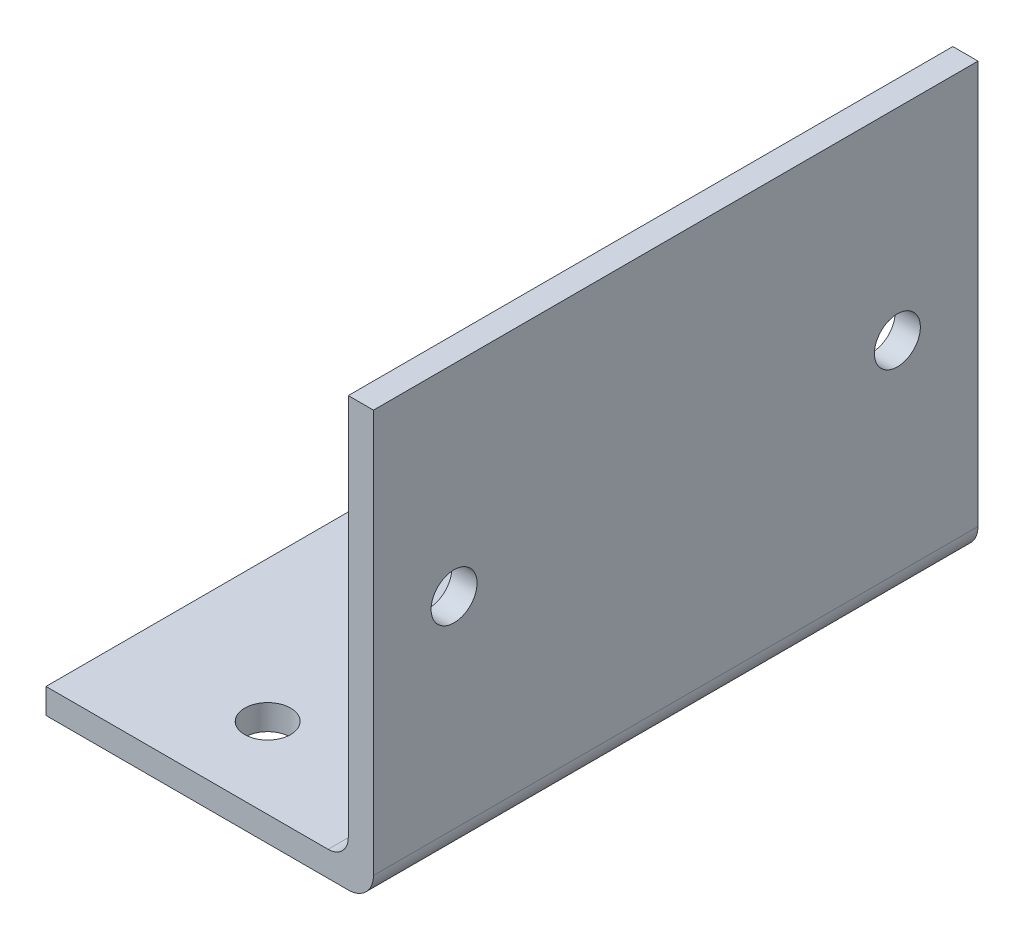
ISO-10303-21;
HEADER;
FILE_DESCRIPTION(('STEP AP214'),'2;1');
FILE_NAME('part.step','',(''),(''),'','','');
FILE_SCHEMA(('AUTOMOTIVE_DESIGN { 1 0 10303 214 1 1 1 1 }'));
ENDSEC;
DATA;
#1=APPLICATION_CONTEXT('core data for automotive mechanical design processes');
#2=APPLICATION_PROTOCOL_DEFINITION('international standard','automotive_design',2000,#1);
#3=PRODUCT_CONTEXT('',#1,'mechanical');
#4=PRODUCT('Part','Part','',(#3));
#5=PRODUCT_RELATED_PRODUCT_CATEGORY('part','',(#4));
#6=PRODUCT_DEFINITION_FORMATION('','',#4);
#7=PRODUCT_DEFINITION_CONTEXT('part definition',#1,'design');
#8=PRODUCT_DEFINITION('design','',#6,#7);
#9=PRODUCT_DEFINITION_SHAPE('','',#8);
#10=(LENGTH_UNIT() NAMED_UNIT(*) SI_UNIT(.MILLI.,.METRE.));
#11=(NAMED_UNIT(*) PLANE_ANGLE_UNIT() SI_UNIT($,.RADIAN.));
#12=(NAMED_UNIT(*) SI_UNIT($,.STERADIAN.) SOLID_ANGLE_UNIT());
#13=UNCERTAINTY_MEASURE_WITH_UNIT(LENGTH_MEASURE(1.E-05),#10,'distance_accuracy_value','');
#14=(GEOMETRIC_REPRESENTATION_CONTEXT(3) GLOBAL_UNCERTAINTY_ASSIGNED_CONTEXT((#13)) GLOBAL_UNIT_ASSIGNED_CONTEXT((#10,
#11,#12)) REPRESENTATION_CONTEXT('',''));
#15=CARTESIAN_POINT('',(0.,0.,0.));
#16=DIRECTION('',(0.,0.,1.));
#17=DIRECTION('',(1.,0.,0.));
#18=AXIS2_PLACEMENT_3D('',#15,#16,#17);
#19=CARTESIAN_POINT('',(0.,3.175,76.2));
#20=DIRECTION('',(1.,0.,0.));
#21=DIRECTION('',(0.,1.,0.));
#22=AXIS2_PLACEMENT_3D('',#19,#20,#21);
#23=PLANE('',#22);
#24=DIRECTION('',(0.,-1.,0.));
#25=VECTOR('',#24,1.);
#26=CARTESIAN_POINT('',(0.,3.175,0.));
#27=LINE('',#26,#25);
#28=CARTESIAN_POINT('',(0.,3.175,0.));
#29=VERTEX_POINT('',#28);
#30=CARTESIAN_POINT('',(0.,0.,0.));
#31=VERTEX_POINT('',#30);
#32=EDGE_CURVE('E141',#29,#31,#27,.T.);
#33=ORIENTED_EDGE('',*,*,#32,.T.);
#34=DIRECTION('',(0.,0.,-1.));
#35=VECTOR('',#34,1.);
#36=CARTESIAN_POINT('',(0.,0.,76.2));
#37=LINE('',#36,#35);
#38=CARTESIAN_POINT('',(0.,0.,76.2));
#39=VERTEX_POINT('',#38);
#40=EDGE_CURVE('E11',#39,#31,#37,.T.);
#41=ORIENTED_EDGE('',*,*,#40,.F.);
#42=DIRECTION('',(0.,-1.,0.));
#43=VECTOR('',#42,1.);
#44=CARTESIAN_POINT('',(0.,3.175,76.2));
#45=LINE('',#44,#43);
#46=CARTESIAN_POINT('',(0.,3.175,76.2));
#47=VERTEX_POINT('',#46);
#48=EDGE_CURVE('E164',#47,#39,#45,.T.);
#49=ORIENTED_EDGE('',*,*,#48,.F.);
#50=DIRECTION('',(0.,0.,-1.));
#51=VECTOR('',#50,1.);
#52=CARTESIAN_POINT('',(0.,3.175,76.2));
#53=LINE('',#52,#51);
#54=EDGE_CURVE('E137',#47,#29,#53,.T.);
#55=ORIENTED_EDGE('',*,*,#54,.T.);
#56=EDGE_LOOP('',(#33,#41,#49,#55));
#57=FACE_BOUND('',#56,.T.);
#58=ADVANCED_FACE('F39',(#57),#23,.F.);
#59=CARTESIAN_POINT('',(0.,0.,76.2));
#60=DIRECTION('',(0.,1.,0.));
#61=DIRECTION('',(0.,0.,1.));
#62=AXIS2_PLACEMENT_3D('',#59,#60,#61);
#63=PLANE('',#62);
#64=CARTESIAN_POINT('',(17.78,0.,66.04));
#65=DIRECTION('',(0.,1.,0.));
#66=DIRECTION('',(0.,0.,1.));
#67=AXIS2_PLACEMENT_3D('',#64,#65,#66);
#68=CIRCLE('',#67,2.89559999999999);
#69=CARTESIAN_POINT('',(17.78,0.,68.9356));
#70=VERTEX_POINT('',#69);
#71=EDGE_CURVE('E216',#70,#70,#68,.T.);
#72=ORIENTED_EDGE('',*,*,#71,.T.);
#73=EDGE_LOOP('',(#72));
#74=FACE_BOUND('',#73,.T.);
#75=CARTESIAN_POINT('',(17.78,0.,10.16));
#76=DIRECTION('',(0.,1.,0.));
#77=DIRECTION('',(0.,0.,1.));
#78=AXIS2_PLACEMENT_3D('',#75,#76,#77);
#79=CIRCLE('',#78,2.89559999999999);
#80=CARTESIAN_POINT('',(17.78,0.,13.0556));
#81=VERTEX_POINT('',#80);
#82=EDGE_CURVE('E146',#81,#81,#79,.T.);
#83=ORIENTED_EDGE('',*,*,#82,.T.);
#84=EDGE_LOOP('',(#83));
#85=FACE_BOUND('',#84,.T.);
#86=DIRECTION('',(1.,0.,0.));
#87=VECTOR('',#86,1.);
#88=CARTESIAN_POINT('',(0.,0.,0.));
#89=LINE('',#88,#87);
#90=CARTESIAN_POINT('',(38.1,0.,0.));
#91=VERTEX_POINT('',#90);
#92=EDGE_CURVE('E145',#31,#91,#89,.T.);
#93=ORIENTED_EDGE('',*,*,#92,.T.);
#94=DIRECTION('',(0.,0.,-1.));
#95=VECTOR('',#94,1.);
#96=CARTESIAN_POINT('',(38.1,0.,76.2));
#97=LINE('',#96,#95);
#98=CARTESIAN_POINT('',(38.1,0.,76.2));
#99=VERTEX_POINT('',#98);
#100=EDGE_CURVE('E49',#99,#91,#97,.T.);
#101=ORIENTED_EDGE('',*,*,#100,.F.);
#102=DIRECTION('',(1.,0.,0.));
#103=VECTOR('',#102,1.);
#104=CARTESIAN_POINT('',(0.,0.,76.2));
#105=LINE('',#104,#103);
#106=EDGE_CURVE('E100',#39,#99,#105,.T.);
#107=ORIENTED_EDGE('',*,*,#106,.F.);
#108=ORIENTED_EDGE('',*,*,#40,.T.);
#109=EDGE_LOOP('',(#93,#101,#107,#108));
#110=FACE_BOUND('',#109,.T.);
#111=ADVANCED_FACE('F265',(#74,#85,#110),#63,.F.);
#112=CARTESIAN_POINT('',(38.1,3.175,76.2));
#113=DIRECTION('',(0.,0.,-1.));
#114=DIRECTION('',(-1.,0.,0.));
#115=AXIS2_PLACEMENT_3D('',#112,#113,#114);
#116=CYLINDRICAL_SURFACE('',#115,3.175);
#117=CARTESIAN_POINT('',(38.1,3.175,0.));
#118=DIRECTION('',(0.,0.,1.));
#119=DIRECTION('',(1.,0.,0.));
#120=AXIS2_PLACEMENT_3D('',#117,#118,#119);
#121=CIRCLE('',#120,3.175);
#122=CARTESIAN_POINT('',(41.275,3.175,0.));
#123=VERTEX_POINT('',#122);
#124=EDGE_CURVE('E149',#91,#123,#121,.T.);
#125=ORIENTED_EDGE('',*,*,#124,.T.);
#126=DIRECTION('',(0.,0.,-1.));
#127=VECTOR('',#126,1.);
#128=CARTESIAN_POINT('',(41.275,3.175,76.2));
#129=LINE('',#128,#127);
#130=CARTESIAN_POINT('',(41.275,3.175,76.2));
#131=VERTEX_POINT('',#130);
#132=EDGE_CURVE('E175',#131,#123,#129,.T.);
#133=ORIENTED_EDGE('',*,*,#132,.F.);
#134=CARTESIAN_POINT('',(38.1,3.175,76.2));
#135=DIRECTION('',(0.,0.,1.));
#136=DIRECTION('',(1.,0.,0.));
#137=AXIS2_PLACEMENT_3D('',#134,#135,#136);
#138=CIRCLE('',#137,3.175);
#139=EDGE_CURVE('E186',#99,#131,#138,.T.);
#140=ORIENTED_EDGE('',*,*,#139,.F.);
#141=ORIENTED_EDGE('',*,*,#100,.T.);
#142=EDGE_LOOP('',(#125,#133,#140,#141));
#143=FACE_BOUND('',#142,.T.);
#144=ADVANCED_FACE('F184',(#143),#116,.T.);
#145=CARTESIAN_POINT('',(41.275,3.175,76.2));
#146=DIRECTION('',(-1.,0.,0.));
#147=DIRECTION('',(0.,-1.,0.));
#148=AXIS2_PLACEMENT_3D('',#145,#146,#147);
#149=PLANE('',#148);
#150=CARTESIAN_POINT('',(41.275,28.575,10.16));
#151=DIRECTION('',(1.,0.,0.));
#152=DIRECTION('',(0.,0.,-1.));
#153=AXIS2_PLACEMENT_3D('',#150,#151,#152);
#154=CIRCLE('',#153,2.89559999999999);
#155=CARTESIAN_POINT('',(41.275,28.575,7.26440000000001));
#156=VERTEX_POINT('',#155);
#157=EDGE_CURVE('E232',#156,#156,#154,.T.);
#158=ORIENTED_EDGE('',*,*,#157,.F.);
#159=EDGE_LOOP('',(#158));
#160=FACE_BOUND('',#159,.T.);
#161=CARTESIAN_POINT('',(41.275,28.575,66.04));
#162=DIRECTION('',(1.,0.,0.));
#163=DIRECTION('',(0.,0.,-1.));
#164=AXIS2_PLACEMENT_3D('',#161,#162,#163);
#165=CIRCLE('',#164,2.89559999999999);
#166=CARTESIAN_POINT('',(41.275,28.575,63.1444));
#167=VERTEX_POINT('',#166);
#168=EDGE_CURVE('E224',#167,#167,#165,.T.);
#169=ORIENTED_EDGE('',*,*,#168,.F.);
#170=EDGE_LOOP('',(#169));
#171=FACE_BOUND('',#170,.T.);
#172=DIRECTION('',(0.,1.,0.));
#173=VECTOR('',#172,1.);
#174=CARTESIAN_POINT('',(41.275,3.175,0.));
#175=LINE('',#174,#173);
#176=CARTESIAN_POINT('',(41.275,53.975,0.));
#177=VERTEX_POINT('',#176);
#178=EDGE_CURVE('E152',#123,#177,#175,.T.);
#179=ORIENTED_EDGE('',*,*,#178,.T.);
#180=DIRECTION('',(0.,0.,-1.));
#181=VECTOR('',#180,1.);
#182=CARTESIAN_POINT('',(41.275,53.975,76.2));
#183=LINE('',#182,#181);
#184=CARTESIAN_POINT('',(41.275,53.975,76.2));
#185=VERTEX_POINT('',#184);
#186=EDGE_CURVE('E171',#185,#177,#183,.T.);
#187=ORIENTED_EDGE('',*,*,#186,.F.);
#188=DIRECTION('',(0.,1.,0.));
#189=VECTOR('',#188,1.);
#190=CARTESIAN_POINT('',(41.275,3.175,76.2));
#191=LINE('',#190,#189);
#192=EDGE_CURVE('E199',#131,#185,#191,.T.);
#193=ORIENTED_EDGE('',*,*,#192,.F.);
#194=ORIENTED_EDGE('',*,*,#132,.T.);
#195=EDGE_LOOP('',(#179,#187,#193,#194));
#196=FACE_BOUND('',#195,.T.);
#197=ADVANCED_FACE('F194',(#160,#171,#196),#149,.F.);
#198=CARTESIAN_POINT('',(41.275,53.975,76.2));
#199=DIRECTION('',(0.,-1.,0.));
#200=DIRECTION('',(0.,0.,-1.));
#201=AXIS2_PLACEMENT_3D('',#198,#199,#200);
#202=PLANE('',#201);
#203=DIRECTION('',(-1.,0.,0.));
#204=VECTOR('',#203,1.);
#205=CARTESIAN_POINT('',(41.275,53.975,0.));
#206=LINE('',#205,#204);
#207=CARTESIAN_POINT('',(38.1,53.975,0.));
#208=VERTEX_POINT('',#207);
#209=EDGE_CURVE('E155',#177,#208,#206,.T.);
#210=ORIENTED_EDGE('',*,*,#209,.T.);
#211=DIRECTION('',(0.,0.,-1.));
#212=VECTOR('',#211,1.);
#213=CARTESIAN_POINT('',(38.1,53.975,76.2));
#214=LINE('',#213,#212);
#215=CARTESIAN_POINT('',(38.1,53.975,76.2));
#216=VERTEX_POINT('',#215);
#217=EDGE_CURVE('E130',#216,#208,#214,.T.);
#218=ORIENTED_EDGE('',*,*,#217,.F.);
#219=DIRECTION('',(-1.,0.,0.));
#220=VECTOR('',#219,1.);
#221=CARTESIAN_POINT('',(41.275,53.975,76.2));
#222=LINE('',#221,#220);
#223=EDGE_CURVE('E119',#185,#216,#222,.T.);
#224=ORIENTED_EDGE('',*,*,#223,.F.);
#225=ORIENTED_EDGE('',*,*,#186,.T.);
#226=EDGE_LOOP('',(#210,#218,#224,#225));
#227=FACE_BOUND('',#226,.T.);
#228=ADVANCED_FACE('F197',(#227),#202,.F.);
#229=CARTESIAN_POINT('',(38.1,53.975,76.2));
#230=DIRECTION('',(1.,0.,0.));
#231=DIRECTION('',(0.,1.,0.));
#232=AXIS2_PLACEMENT_3D('',#229,#230,#231);
#233=PLANE('',#232);
#234=CARTESIAN_POINT('',(38.1,28.575,10.16));
#235=DIRECTION('',(1.,0.,0.));
#236=DIRECTION('',(0.,1.,0.));
#237=AXIS2_PLACEMENT_3D('',#234,#235,#236);
#238=CIRCLE('',#237,2.89559999999998);
#239=CARTESIAN_POINT('',(38.1,31.4706,10.16));
#240=VERTEX_POINT('',#239);
#241=EDGE_CURVE('E228',#240,#240,#238,.T.);
#242=ORIENTED_EDGE('',*,*,#241,.T.);
#243=EDGE_LOOP('',(#242));
#244=FACE_BOUND('',#243,.T.);
#245=CARTESIAN_POINT('',(38.1,28.575,66.04));
#246=DIRECTION('',(1.,0.,0.));
#247=DIRECTION('',(0.,1.,0.));
#248=AXIS2_PLACEMENT_3D('',#245,#246,#247);
#249=CIRCLE('',#248,2.89559999999998);
#250=CARTESIAN_POINT('',(38.1,31.4706,66.04));
#251=VERTEX_POINT('',#250);
#252=EDGE_CURVE('E42',#251,#251,#249,.T.);
#253=ORIENTED_EDGE('',*,*,#252,.T.);
#254=EDGE_LOOP('',(#253));
#255=FACE_BOUND('',#254,.T.);
#256=DIRECTION('',(0.,-1.,0.));
#257=VECTOR('',#256,1.);
#258=CARTESIAN_POINT('',(38.1,53.975,0.));
#259=LINE('',#258,#257);
#260=CARTESIAN_POINT('',(38.1,5.71500000000001,0.));
#261=VERTEX_POINT('',#260);
#262=EDGE_CURVE('E128',#208,#261,#259,.T.);
#263=ORIENTED_EDGE('',*,*,#262,.T.);
#264=DIRECTION('',(0.,0.,-1.));
#265=VECTOR('',#264,1.);
#266=CARTESIAN_POINT('',(38.1,5.71500000000001,76.2));
#267=LINE('',#266,#265);
#268=CARTESIAN_POINT('',(38.1,5.71500000000001,76.2));
#269=VERTEX_POINT('',#268);
#270=EDGE_CURVE('E125',#269,#261,#267,.T.);
#271=ORIENTED_EDGE('',*,*,#270,.F.);
#272=DIRECTION('',(0.,-1.,0.));
#273=VECTOR('',#272,1.);
#274=CARTESIAN_POINT('',(38.1,53.975,76.2));
#275=LINE('',#274,#273);
#276=EDGE_CURVE('E113',#216,#269,#275,.T.);
#277=ORIENTED_EDGE('',*,*,#276,.F.);
#278=ORIENTED_EDGE('',*,*,#217,.T.);
#279=EDGE_LOOP('',(#263,#271,#277,#278));
#280=FACE_BOUND('',#279,.T.);
#281=ADVANCED_FACE('F126',(#244,#255,#280),#233,.F.);
#282=CARTESIAN_POINT('',(35.56,5.71500000000001,76.2));
#283=DIRECTION('',(0.,0.,-1.));
#284=DIRECTION('',(-1.,0.,0.));
#285=AXIS2_PLACEMENT_3D('',#282,#283,#284);
#286=CYLINDRICAL_SURFACE('',#285,2.54);
#287=CARTESIAN_POINT('',(35.56,5.71500000000001,0.));
#288=DIRECTION('',(0.,0.,-1.));
#289=DIRECTION('',(1.,0.,0.));
#290=AXIS2_PLACEMENT_3D('',#287,#288,#289);
#291=CIRCLE('',#290,2.54);
#292=CARTESIAN_POINT('',(35.56,3.175,0.));
#293=VERTEX_POINT('',#292);
#294=EDGE_CURVE('E86',#261,#293,#291,.T.);
#295=ORIENTED_EDGE('',*,*,#294,.T.);
#296=DIRECTION('',(0.,0.,-1.));
#297=VECTOR('',#296,1.);
#298=CARTESIAN_POINT('',(35.56,3.175,76.2));
#299=LINE('',#298,#297);
#300=CARTESIAN_POINT('',(35.56,3.175,76.2));
#301=VERTEX_POINT('',#300);
#302=EDGE_CURVE('E131',#301,#293,#299,.T.);
#303=ORIENTED_EDGE('',*,*,#302,.F.);
#304=CARTESIAN_POINT('',(35.56,5.71500000000001,76.2));
#305=DIRECTION('',(0.,0.,-1.));
#306=DIRECTION('',(1.,0.,0.));
#307=AXIS2_PLACEMENT_3D('',#304,#305,#306);
#308=CIRCLE('',#307,2.54);
#309=EDGE_CURVE('E117',#269,#301,#308,.T.);
#310=ORIENTED_EDGE('',*,*,#309,.F.);
#311=ORIENTED_EDGE('',*,*,#270,.T.);
#312=EDGE_LOOP('',(#295,#303,#310,#311));
#313=FACE_BOUND('',#312,.T.);
#314=ADVANCED_FACE('F133',(#313),#286,.F.);
#315=CARTESIAN_POINT('',(35.56,3.175,76.2));
#316=DIRECTION('',(0.,-1.,0.));
#317=DIRECTION('',(1.,0.,0.));
#318=AXIS2_PLACEMENT_3D('',#315,#316,#317);
#319=PLANE('',#318);
#320=CARTESIAN_POINT('',(17.78,3.175,66.04));
#321=DIRECTION('',(0.,1.,0.));
#322=DIRECTION('',(0.,0.,1.));
#323=AXIS2_PLACEMENT_3D('',#320,#321,#322);
#324=CIRCLE('',#323,2.89559999999999);
#325=CARTESIAN_POINT('',(17.78,3.175,68.9356));
#326=VERTEX_POINT('',#325);
#327=EDGE_CURVE('E220',#326,#326,#324,.T.);
#328=ORIENTED_EDGE('',*,*,#327,.F.);
#329=EDGE_LOOP('',(#328));
#330=FACE_BOUND('',#329,.T.);
#331=CARTESIAN_POINT('',(17.78,3.175,10.16));
#332=DIRECTION('',(0.,1.,0.));
#333=DIRECTION('',(0.,0.,1.));
#334=AXIS2_PLACEMENT_3D('',#331,#332,#333);
#335=CIRCLE('',#334,2.89559999999999);
#336=CARTESIAN_POINT('',(17.78,3.175,13.0556));
#337=VERTEX_POINT('',#336);
#338=EDGE_CURVE('E212',#337,#337,#335,.T.);
#339=ORIENTED_EDGE('',*,*,#338,.F.);
#340=EDGE_LOOP('',(#339));
#341=FACE_BOUND('',#340,.T.);
#342=DIRECTION('',(-1.,0.,0.));
#343=VECTOR('',#342,1.);
#344=CARTESIAN_POINT('',(35.56,3.175,0.));
#345=LINE('',#344,#343);
#346=EDGE_CURVE('E92',#293,#29,#345,.T.);
#347=ORIENTED_EDGE('',*,*,#346,.T.);
#348=ORIENTED_EDGE('',*,*,#54,.F.);
#349=DIRECTION('',(-1.,0.,0.));
#350=VECTOR('',#349,1.);
#351=CARTESIAN_POINT('',(35.56,3.175,76.2));
#352=LINE('',#351,#350);
#353=EDGE_CURVE('E57',#301,#47,#352,.T.);
#354=ORIENTED_EDGE('',*,*,#353,.F.);
#355=ORIENTED_EDGE('',*,*,#302,.T.);
#356=EDGE_LOOP('',(#347,#348,#354,#355));
#357=FACE_BOUND('',#356,.T.);
#358=ADVANCED_FACE('F261',(#330,#341,#357),#319,.F.);
#359=CARTESIAN_POINT('',(38.1,3.175,76.2));
#360=DIRECTION('',(0.,0.,1.));
#361=DIRECTION('',(1.,0.,0.));
#362=AXIS2_PLACEMENT_3D('',#359,#360,#361);
#363=PLANE('',#362);
#364=ORIENTED_EDGE('',*,*,#48,.T.);
#365=ORIENTED_EDGE('',*,*,#106,.T.);
#366=ORIENTED_EDGE('',*,*,#139,.T.);
#367=ORIENTED_EDGE('',*,*,#192,.T.);
#368=ORIENTED_EDGE('',*,*,#223,.T.);
#369=ORIENTED_EDGE('',*,*,#276,.T.);
#370=ORIENTED_EDGE('',*,*,#309,.T.);
#371=ORIENTED_EDGE('',*,*,#353,.T.);
#372=EDGE_LOOP('',(#364,#365,#366,#367,#368,#369,#370,#371));
#373=FACE_BOUND('',#372,.T.);
#374=ADVANCED_FACE('F115',(#373),#363,.T.);
#375=CARTESIAN_POINT('',(38.1,3.175,0.));
#376=DIRECTION('',(0.,0.,1.));
#377=DIRECTION('',(1.,0.,0.));
#378=AXIS2_PLACEMENT_3D('',#375,#376,#377);
#379=PLANE('',#378);
#380=ORIENTED_EDGE('',*,*,#32,.F.);
#381=ORIENTED_EDGE('',*,*,#346,.F.);
#382=ORIENTED_EDGE('',*,*,#294,.F.);
#383=ORIENTED_EDGE('',*,*,#262,.F.);
#384=ORIENTED_EDGE('',*,*,#209,.F.);
#385=ORIENTED_EDGE('',*,*,#178,.F.);
#386=ORIENTED_EDGE('',*,*,#124,.F.);
#387=ORIENTED_EDGE('',*,*,#92,.F.);
#388=EDGE_LOOP('',(#380,#381,#382,#383,#384,#385,#386,#387));
#389=FACE_BOUND('',#388,.T.);
#390=ADVANCED_FACE('F190',(#389),#379,.F.);
#391=CARTESIAN_POINT('',(17.78,3.175,10.16));
#392=DIRECTION('',(0.,1.,0.));
#393=DIRECTION('',(0.,0.,1.));
#394=AXIS2_PLACEMENT_3D('',#391,#392,#393);
#395=CYLINDRICAL_SURFACE('',#394,2.89559999999999);
#396=ORIENTED_EDGE('',*,*,#338,.T.);
#397=EDGE_LOOP('',(#396));
#398=FACE_BOUND('',#397,.T.);
#399=ORIENTED_EDGE('',*,*,#82,.F.);
#400=EDGE_LOOP('',(#399));
#401=FACE_BOUND('',#400,.T.);
#402=ADVANCED_FACE('F284',(#398,#401),#395,.F.);
#403=CARTESIAN_POINT('',(17.78,3.175,66.04));
#404=DIRECTION('',(0.,1.,0.));
#405=DIRECTION('',(0.,0.,1.));
#406=AXIS2_PLACEMENT_3D('',#403,#404,#405);
#407=CYLINDRICAL_SURFACE('',#406,2.89559999999999);
#408=ORIENTED_EDGE('',*,*,#327,.T.);
#409=EDGE_LOOP('',(#408));
#410=FACE_BOUND('',#409,.T.);
#411=ORIENTED_EDGE('',*,*,#71,.F.);
#412=EDGE_LOOP('',(#411));
#413=FACE_BOUND('',#412,.T.);
#414=ADVANCED_FACE('F248',(#410,#413),#407,.F.);
#415=CARTESIAN_POINT('',(41.275,28.575,66.04));
#416=DIRECTION('',(1.,0.,0.));
#417=DIRECTION('',(0.,0.,-1.));
#418=AXIS2_PLACEMENT_3D('',#415,#416,#417);
#419=CYLINDRICAL_SURFACE('',#418,2.89559999999998);
#420=ORIENTED_EDGE('',*,*,#168,.T.);
#421=EDGE_LOOP('',(#420));
#422=FACE_BOUND('',#421,.T.);
#423=ORIENTED_EDGE('',*,*,#252,.F.);
#424=EDGE_LOOP('',(#423));
#425=FACE_BOUND('',#424,.T.);
#426=ADVANCED_FACE('F245',(#422,#425),#419,.F.);
#427=CARTESIAN_POINT('',(41.275,28.575,10.16));
#428=DIRECTION('',(1.,0.,0.));
#429=DIRECTION('',(0.,0.,-1.));
#430=AXIS2_PLACEMENT_3D('',#427,#428,#429);
#431=CYLINDRICAL_SURFACE('',#430,2.89559999999998);
#432=ORIENTED_EDGE('',*,*,#157,.T.);
#433=EDGE_LOOP('',(#432));
#434=FACE_BOUND('',#433,.T.);
#435=ORIENTED_EDGE('',*,*,#241,.F.);
#436=EDGE_LOOP('',(#435));
#437=FACE_BOUND('',#436,.T.);
#438=ADVANCED_FACE('F237',(#434,#437),#431,.F.);
#439=CLOSED_SHELL('',(#58,#111,#144,#197,#228,#281,#314,#358,#374,#390,#402,#414,#426,#438));
#440=MANIFOLD_SOLID_BREP('B2',#439);
#441=ADVANCED_BREP_SHAPE_REPRESENTATION('',(#18,#440),#14);
#442=SHAPE_DEFINITION_REPRESENTATION(#9,#441);
ENDSEC;
END-ISO-10303-21;
